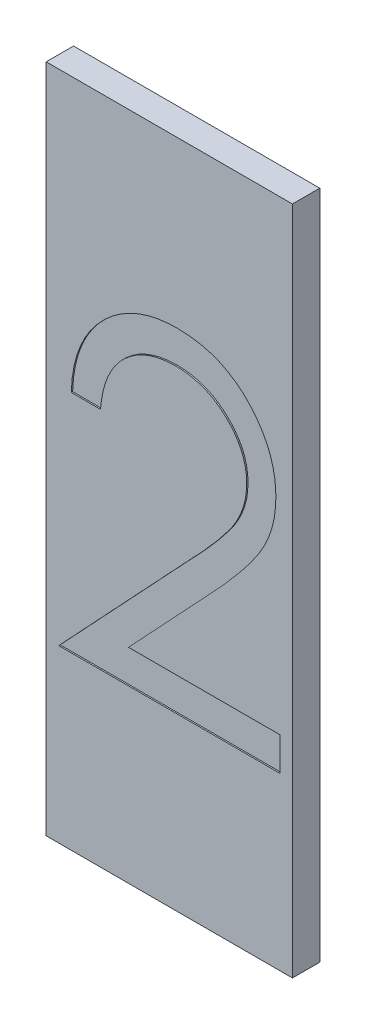
ISO-10303-21;
HEADER;
FILE_DESCRIPTION(('STEP AP214'),'2;1');
FILE_NAME('part.step','',(''),(''),'','','');
FILE_SCHEMA(('AUTOMOTIVE_DESIGN { 1 0 10303 214 1 1 1 1 }'));
ENDSEC;
DATA;
#1=APPLICATION_CONTEXT('core data for automotive mechanical design processes');
#2=APPLICATION_PROTOCOL_DEFINITION('international standard','automotive_design',2000,#1);
#3=PRODUCT_CONTEXT('',#1,'mechanical');
#4=PRODUCT('Part','Part','',(#3));
#5=PRODUCT_RELATED_PRODUCT_CATEGORY('part','',(#4));
#6=PRODUCT_DEFINITION_FORMATION('','',#4);
#7=PRODUCT_DEFINITION_CONTEXT('part definition',#1,'design');
#8=PRODUCT_DEFINITION('design','',#6,#7);
#9=PRODUCT_DEFINITION_SHAPE('','',#8);
#10=(LENGTH_UNIT() NAMED_UNIT(*) SI_UNIT(.MILLI.,.METRE.));
#11=(NAMED_UNIT(*) PLANE_ANGLE_UNIT() SI_UNIT($,.RADIAN.));
#12=(NAMED_UNIT(*) SI_UNIT($,.STERADIAN.) SOLID_ANGLE_UNIT());
#13=UNCERTAINTY_MEASURE_WITH_UNIT(LENGTH_MEASURE(1.E-05),#10,'distance_accuracy_value','');
#14=(GEOMETRIC_REPRESENTATION_CONTEXT(3) GLOBAL_UNCERTAINTY_ASSIGNED_CONTEXT((#13)) GLOBAL_UNIT_ASSIGNED_CONTEXT((#10,
#11,#12)) REPRESENTATION_CONTEXT('',''));
#15=CARTESIAN_POINT('',(0.,0.,0.));
#16=DIRECTION('',(0.,0.,1.));
#17=DIRECTION('',(1.,0.,0.));
#18=AXIS2_PLACEMENT_3D('',#15,#16,#17);
#19=CARTESIAN_POINT('',(0.,0.,2.));
#20=DIRECTION('',(0.,0.,1.));
#21=DIRECTION('',(1.,0.,0.));
#22=AXIS2_PLACEMENT_3D('',#19,#20,#21);
#23=PLANE('',#22);
#24=DIRECTION('',(0.,-1.,0.));
#25=VECTOR('',#24,1.);
#26=CARTESIAN_POINT('',(0.,0.,2.));
#27=LINE('',#26,#25);
#28=CARTESIAN_POINT('',(0.,49.,2.));
#29=VERTEX_POINT('',#28);
#30=CARTESIAN_POINT('',(0.,0.,2.));
#31=VERTEX_POINT('',#30);
#32=EDGE_CURVE('E186',#29,#31,#27,.T.);
#33=ORIENTED_EDGE('',*,*,#32,.T.);
#34=DIRECTION('',(1.,0.,0.));
#35=VECTOR('',#34,1.);
#36=CARTESIAN_POINT('',(18.,0.,2.));
#37=LINE('',#36,#35);
#38=CARTESIAN_POINT('',(18.,0.,2.));
#39=VERTEX_POINT('',#38);
#40=EDGE_CURVE('E85',#31,#39,#37,.T.);
#41=ORIENTED_EDGE('',*,*,#40,.T.);
#42=DIRECTION('',(0.,1.,0.));
#43=VECTOR('',#42,1.);
#44=CARTESIAN_POINT('',(18.,0.,2.));
#45=LINE('',#44,#43);
#46=CARTESIAN_POINT('',(18.,49.,2.));
#47=VERTEX_POINT('',#46);
#48=EDGE_CURVE('E189',#39,#47,#45,.T.);
#49=ORIENTED_EDGE('',*,*,#48,.T.);
#50=DIRECTION('',(-1.,0.,0.));
#51=VECTOR('',#50,1.);
#52=CARTESIAN_POINT('',(18.,49.,2.));
#53=LINE('',#52,#51);
#54=EDGE_CURVE('E57',#47,#29,#53,.T.);
#55=ORIENTED_EDGE('',*,*,#54,.T.);
#56=EDGE_LOOP('',(#33,#41,#49,#55));
#57=FACE_BOUND('',#56,.T.);
#58=CARTESIAN_POINT('',(14.6538461538462,29.6533954326923,2.));
#59=CARTESIAN_POINT('',(14.6495208357019,29.8158742325944,2.));
#60=CARTESIAN_POINT('',(14.6409964642234,30.1360887466597,2.));
#61=CARTESIAN_POINT('',(14.5657646294888,30.6055743571257,2.));
#62=CARTESIAN_POINT('',(14.4520735076672,31.058452822551,2.));
#63=CARTESIAN_POINT('',(14.2891602341625,31.4961171776206,2.));
#64=CARTESIAN_POINT('',(14.0741215203676,31.914167060428,2.));
#65=CARTESIAN_POINT('',(13.8123651319997,32.3131113453846,2.));
#66=CARTESIAN_POINT('',(13.5103541648174,32.6987987693352,2.));
#67=CARTESIAN_POINT('',(13.1609821359771,33.0604310293374,2.));
#68=CARTESIAN_POINT('',(12.7771823315787,33.3916370880663,2.));
#69=CARTESIAN_POINT('',(12.3717285977935,33.6850348834748,2.));
#70=CARTESIAN_POINT('',(11.9427627098823,33.9302295480167,2.));
#71=CARTESIAN_POINT('',(11.4920933072218,34.1312308413336,2.));
#72=CARTESIAN_POINT('',(11.0209768099971,34.2889062026872,2.));
#73=CARTESIAN_POINT('',(10.528502026218,34.3981618948337,2.));
#74=CARTESIAN_POINT('',(10.0160297011531,34.4667587945421,2.));
#75=CARTESIAN_POINT('',(9.6660982394007,34.4760400355615,2.));
#76=CARTESIAN_POINT('',(9.48779296875,34.4807692307692,2.));
#77=B_SPLINE_CURVE_WITH_KNOTS('',3,(#58,#59,#60,#61,#62,#63,#64,#65,#66,#67,#68,#69,#70,#71,#72,
#73,#74,#75,#76),.UNSPECIFIED.,.F.,.F.,(4,1,1,1,1,1,1,1,1,1,1,1,1,1,1,1,4),(0.,
0.0619654006870623,0.122121905638296,0.180988496849842,0.239933216451902,0.299905831106524,
0.359988847476987,0.421775741741646,0.486575826421127,0.551534804619741,0.61501754275998,
0.677258616661657,0.739729962362713,0.803050102662951,0.866495132015698,0.931973474177149,1.),.UNSPECIFIED.);
#78=CARTESIAN_POINT('',(14.6538461538462,29.6533954326923,2.));
#79=VERTEX_POINT('',#78);
#80=CARTESIAN_POINT('',(9.48779296875,34.4807692307692,2.));
#81=VERTEX_POINT('',#80);
#82=EDGE_CURVE('E171',#79,#81,#77,.T.);
#83=ORIENTED_EDGE('',*,*,#82,.T.);
#84=CARTESIAN_POINT('',(9.48779296875,34.4807692307692,2.));
#85=CARTESIAN_POINT('',(9.30157355303286,34.4759044576878,2.));
#86=CARTESIAN_POINT('',(8.93586936803907,34.4663508465992,2.));
#87=CARTESIAN_POINT('',(8.39893809038155,34.3995216505106,2.));
#88=CARTESIAN_POINT('',(7.88672592544241,34.2842294149529,2.));
#89=CARTESIAN_POINT('',(7.39794440713774,34.1265452552841,2.));
#90=CARTESIAN_POINT('',(6.93176651080472,33.9261219141893,2.));
#91=CARTESIAN_POINT('',(6.4904593540508,33.6764870084284,2.));
#92=CARTESIAN_POINT('',(6.075013625336,33.3786028853727,2.));
#93=CARTESIAN_POINT('',(5.68464835043184,33.0408698146681,2.));
#94=CARTESIAN_POINT('',(5.32498449287451,32.6648527421097,2.));
#95=CARTESIAN_POINT('',(5.00897985529355,32.2456849576721,2.));
#96=CARTESIAN_POINT('',(4.73286361620919,31.791019863808,2.));
#97=CARTESIAN_POINT('',(4.49195436699842,31.3020842608273,2.));
#98=CARTESIAN_POINT('',(4.29631297554243,30.774441579147,2.));
#99=CARTESIAN_POINT('',(4.14681707707369,30.2099648729459,2.));
#100=CARTESIAN_POINT('',(4.02852442348558,29.6111051170872,2.));
#101=CARTESIAN_POINT('',(3.98900573865615,29.1975494504737,2.));
#102=CARTESIAN_POINT('',(3.96875,28.9855769230769,2.));
#103=B_SPLINE_CURVE_WITH_KNOTS('',3,(#84,#85,#86,#87,#88,#89,#90,#91,#92,#93,#94,#95,#96,#97,
#98,#99,#100,#101,#102),.UNSPECIFIED.,.F.,.F.,(4,1,1,1,1,1,1,1,1,1,1,1,1,1,1,1,4),(0.,
0.0644386715952428,0.126546911271677,0.18688715343657,0.245877535589455,0.304040884691267,
0.362191218072661,0.420975932791644,0.480660283279666,0.540600274953758,0.600689098349453,
0.661935789757196,0.724442505913983,0.789038393881744,0.856313757050994,0.926352028205863,1.),.UNSPECIFIED.);
#104=CARTESIAN_POINT('',(3.96875,28.9855769230769,2.));
#105=VERTEX_POINT('',#104);
#106=EDGE_CURVE('E48',#81,#105,#103,.T.);
#107=ORIENTED_EDGE('',*,*,#106,.T.);
#108=DIRECTION('',(-1.,0.,0.));
#109=VECTOR('',#108,1.);
#110=CARTESIAN_POINT('',(3.96875,28.9855769230769,2.));
#111=LINE('',#110,#109);
#112=CARTESIAN_POINT('',(1.83173076923077,28.9855769230769,2.));
#113=VERTEX_POINT('',#112);
#114=EDGE_CURVE('E175',#105,#113,#111,.T.);
#115=ORIENTED_EDGE('',*,*,#114,.T.);
#116=CARTESIAN_POINT('',(1.83173076923077,28.9855769230769,2.));
#117=CARTESIAN_POINT('',(1.84565872094543,29.2690877844971,2.));
#118=CARTESIAN_POINT('',(1.87301284744388,29.8258955711585,2.));
#119=CARTESIAN_POINT('',(2.00111245831392,30.6377242914809,2.));
#120=CARTESIAN_POINT('',(2.18440664072561,31.4137042613768,2.));
#121=CARTESIAN_POINT('',(2.44356456893349,32.1476049260632,2.));
#122=CARTESIAN_POINT('',(2.76541620875994,32.8459153823981,2.));
#123=CARTESIAN_POINT('',(3.15138300219064,33.5058619177263,2.));
#124=CARTESIAN_POINT('',(3.60854116371947,34.1249269695168,2.));
#125=CARTESIAN_POINT('',(4.12701912213568,34.6973715997948,2.));
#126=CARTESIAN_POINT('',(4.69014146999204,35.2225227511261,2.));
#127=CARTESIAN_POINT('',(5.29774080817893,35.6760164566466,2.));
#128=CARTESIAN_POINT('',(5.93622215453755,36.0591777564486,2.));
#129=CARTESIAN_POINT('',(6.60364842249853,36.3794983481429,2.));
#130=CARTESIAN_POINT('',(7.30754975671553,36.6199355141516,2.));
#131=CARTESIAN_POINT('',(8.0415384859446,36.7983363121757,2.));
#132=CARTESIAN_POINT('',(8.80883939615881,36.9056718071743,2.));
#133=CARTESIAN_POINT('',(9.33162597472812,36.9172092056607,2.));
#134=CARTESIAN_POINT('',(9.59750600961539,36.9230769230769,2.));
#135=B_SPLINE_CURVE_WITH_KNOTS('',3,(#116,#117,#118,#119,#120,#121,#122,#123,#124,#125,#126,
#127,#128,#129,#130,#131,#132,#133,#134),.UNSPECIFIED.,.F.,.F.,(4,1,1,1,1,1,1,1,1,1,1,1,1,1,1,1,
4),(0.,0.0687907943906181,0.135103289431128,0.198978674310652,0.261904299780856,
0.323494969367969,0.385195377966051,0.446969238740774,0.509764776703132,0.572250568847368,
0.633405175661153,0.693251162921753,0.75258316278567,0.812579266153421,0.873275084920192,
0.935549942895029,1.),.UNSPECIFIED.);
#136=CARTESIAN_POINT('',(9.59750600961539,36.9230769230769,2.));
#137=VERTEX_POINT('',#136);
#138=EDGE_CURVE('E388',#113,#137,#135,.T.);
#139=ORIENTED_EDGE('',*,*,#138,.T.);
#140=CARTESIAN_POINT('',(9.59750600961539,36.9230769230769,2.));
#141=CARTESIAN_POINT('',(9.85861397795963,36.916964210475,2.));
#142=CARTESIAN_POINT('',(10.3716818085684,36.9049529485679,2.));
#143=CARTESIAN_POINT('',(11.1204965854711,36.8018038030177,2.));
#144=CARTESIAN_POINT('',(11.8333563924452,36.6402489742133,2.));
#145=CARTESIAN_POINT('',(12.5088678039603,36.4135851596532,2.));
#146=CARTESIAN_POINT('',(13.1416412075611,36.1088911090004,2.));
#147=CARTESIAN_POINT('',(13.7364301357034,35.7428757120584,2.));
#148=CARTESIAN_POINT('',(14.3003156519779,35.3195586450442,2.));
#149=CARTESIAN_POINT('',(14.8079082333392,34.8211710928328,2.));
#150=CARTESIAN_POINT('',(15.2740078438573,34.2891155842041,2.));
#151=CARTESIAN_POINT('',(15.676114258321,33.7210996685571,2.));
#152=CARTESIAN_POINT('',(16.0204645312377,33.1344325639603,2.));
#153=CARTESIAN_POINT('',(16.307491424715,32.5246406924861,2.));
#154=CARTESIAN_POINT('',(16.5187840842831,31.8859824456069,2.));
#155=CARTESIAN_POINT('',(16.6792001067686,31.2277559408995,2.));
#156=CARTESIAN_POINT('',(16.7698741177537,30.5431478517298,2.));
#157=CARTESIAN_POINT('',(16.783790302623,30.0797800356264,2.));
#158=CARTESIAN_POINT('',(16.7908653846154,29.8442007211538,2.));
#159=B_SPLINE_CURVE_WITH_KNOTS('',3,(#140,#141,#142,#143,#144,#145,#146,#147,#148,#149,#150,
#151,#152,#153,#154,#155,#156,#157,#158),.UNSPECIFIED.,.F.,.F.,(4,1,1,1,1,1,1,1,1,1,1,1,1,1,1,1,
4),(0.,0.0694754602496704,0.136516797617799,0.200788823609261,0.263829672855826,
0.32573502296542,0.387290692215291,0.449509218762603,0.512967819545441,0.576275215493061,
0.637580100263924,0.697902605917102,0.757172088426985,0.816598528488655,0.876653170892819,
0.93728964241024,1.),.UNSPECIFIED.);
#160=CARTESIAN_POINT('',(16.7908653846154,29.8442007211538,2.));
#161=VERTEX_POINT('',#160);
#162=EDGE_CURVE('E343',#137,#161,#159,.T.);
#163=ORIENTED_EDGE('',*,*,#162,.T.);
#164=CARTESIAN_POINT('',(16.7908653846154,29.8442007211538,2.));
#165=CARTESIAN_POINT('',(16.779345149824,29.5125413466358,2.));
#166=CARTESIAN_POINT('',(16.7565068440513,28.855042750056,2.));
#167=CARTESIAN_POINT('',(16.5611465320479,27.8888344874232,2.));
#168=CARTESIAN_POINT('',(16.2560300904878,26.9527078325656,2.));
#169=CARTESIAN_POINT('',(15.8886552162092,26.1992986880268,2.));
#170=CARTESIAN_POINT('',(15.5180480521467,25.5921922394299,2.));
#171=CARTESIAN_POINT('',(15.1840776879828,25.0923426577437,2.));
#172=CARTESIAN_POINT('',(14.7931117415666,24.5541429531659,2.));
#173=CARTESIAN_POINT('',(14.3394598179276,23.9793953542467,2.));
#174=CARTESIAN_POINT('',(13.832506169902,23.363597946344,2.));
#175=CARTESIAN_POINT('',(13.2676589513506,22.7071227312226,2.));
#176=CARTESIAN_POINT('',(12.6408902611693,22.0167522972684,2.));
#177=CARTESIAN_POINT('',(12.2009815328228,21.5452266878262,2.));
#178=CARTESIAN_POINT('',(11.9730318509615,21.3008939302885,2.));
#179=B_SPLINE_CURVE_WITH_KNOTS('',3,(#164,#165,#166,#167,#168,#169,#170,#171,#172,#173,#174,
#175,#176,#177,#178),.UNSPECIFIED.,.F.,.F.,(4,1,1,1,1,1,1,1,1,1,1,1,4),(0.,0.0987021963061522,
0.195672308810664,0.292422426507954,0.391342543799825,0.444462440671892,0.504228775449316,
0.570352337994678,0.642545753097748,0.722287505344018,0.807921122682712,0.900469537985015,1.),.UNSPECIFIED.);
#180=CARTESIAN_POINT('',(11.9730318509615,21.3008939302885,2.));
#181=VERTEX_POINT('',#180);
#182=EDGE_CURVE('E340',#161,#181,#179,.T.);
#183=ORIENTED_EDGE('',*,*,#182,.T.);
#184=DIRECTION('',(-0.683740795861405,-0.729724964678345,0.));
#185=VECTOR('',#184,1.);
#186=CARTESIAN_POINT('',(11.9730318509615,21.3008939302885,2.));
#187=LINE('',#186,#185);
#188=CARTESIAN_POINT('',(6.01513671875,14.9423076923077,2.));
#189=VERTEX_POINT('',#188);
#190=EDGE_CURVE('E333',#181,#189,#187,.T.);
#191=ORIENTED_EDGE('',*,*,#190,.T.);
#192=DIRECTION('',(1.,0.,0.));
#193=VECTOR('',#192,1.);
#194=CARTESIAN_POINT('',(6.01513671875,14.9423076923077,2.));
#195=LINE('',#194,#193);
#196=CARTESIAN_POINT('',(17.0961538461538,14.9423076923077,2.));
#197=VERTEX_POINT('',#196);
#198=EDGE_CURVE('E324',#189,#197,#195,.T.);
#199=ORIENTED_EDGE('',*,*,#198,.T.);
#200=DIRECTION('',(0.,-1.,0.));
#201=VECTOR('',#200,1.);
#202=CARTESIAN_POINT('',(17.0961538461538,14.9423076923077,2.));
#203=LINE('',#202,#201);
#204=CARTESIAN_POINT('',(17.0961538461538,12.5,2.));
#205=VERTEX_POINT('',#204);
#206=EDGE_CURVE('E332',#197,#205,#203,.T.);
#207=ORIENTED_EDGE('',*,*,#206,.T.);
#208=DIRECTION('',(-1.,0.,0.));
#209=VECTOR('',#208,1.);
#210=CARTESIAN_POINT('',(17.0961538461538,12.5,2.));
#211=LINE('',#210,#209);
#212=CARTESIAN_POINT('',(0.915865384615385,12.5,2.));
#213=VERTEX_POINT('',#212);
#214=EDGE_CURVE('E350',#205,#213,#211,.T.);
#215=ORIENTED_EDGE('',*,*,#214,.T.);
#216=DIRECTION('',(0.683776631973393,0.729691385153424,0.));
#217=VECTOR('',#216,1.);
#218=CARTESIAN_POINT('',(0.915865384615385,12.5,2.));
#219=LINE('',#218,#217);
#220=CARTESIAN_POINT('',(10.1508413461538,22.3550931490385,2.));
#221=VERTEX_POINT('',#220);
#222=EDGE_CURVE('E353',#213,#221,#219,.T.);
#223=ORIENTED_EDGE('',*,*,#222,.T.);
#224=CARTESIAN_POINT('',(10.1508413461538,22.3550931490385,2.));
#225=CARTESIAN_POINT('',(10.3756850046144,22.5898048418067,2.));
#226=CARTESIAN_POINT('',(10.807563656977,23.0406379685245,2.));
#227=CARTESIAN_POINT('',(11.4184058313396,23.6988356080078,2.));
#228=CARTESIAN_POINT('',(11.9670389482507,24.3094530191963,2.));
#229=CARTESIAN_POINT('',(12.4570144240733,24.8713365005775,2.));
#230=CARTESIAN_POINT('',(12.8777030945087,25.3927048457577,2.));
#231=CARTESIAN_POINT('',(13.2510302440105,25.8566723826673,2.));
#232=CARTESIAN_POINT('',(13.5501532826564,26.2836267677979,2.));
#233=CARTESIAN_POINT('',(13.87478838546,26.7785227303099,2.));
#234=CARTESIAN_POINT('',(14.1892085089015,27.3827636739405,2.));
#235=CARTESIAN_POINT('',(14.4593943598192,28.1211803812344,2.));
#236=CARTESIAN_POINT('',(14.6241418108714,28.8813247253336,2.));
#237=CARTESIAN_POINT('',(14.6439050667235,29.3950082273873,2.));
#238=CARTESIAN_POINT('',(14.6538461538462,29.6533954326923,2.));
#239=B_SPLINE_CURVE_WITH_KNOTS('',3,(#224,#225,#226,#227,#228,#229,#230,#231,#232,#233,#234,
#235,#236,#237,#238),.UNSPECIFIED.,.F.,.F.,(4,1,1,1,1,1,1,1,1,1,1,1,4),(0.,0.110802643801319,
0.21282920234777,0.306101309823111,0.39064732111601,0.466924469360852,0.534481039284031,
0.593586940965673,0.644557004508718,0.736200452629373,0.825024025618865,0.911985584829759,1.),.UNSPECIFIED.);
#240=EDGE_CURVE('E356',#221,#79,#239,.T.);
#241=ORIENTED_EDGE('',*,*,#240,.T.);
#242=EDGE_LOOP('',(#83,#107,#115,#139,#163,#183,#191,#199,#207,#215,#223,#241));
#243=FACE_BOUND('',#242,.T.);
#244=ADVANCED_FACE('F33',(#57,#243),#23,.T.);
#245=CARTESIAN_POINT('',(0.,0.,2.));
#246=DIRECTION('',(1.,0.,0.));
#247=DIRECTION('',(0.,0.,-1.));
#248=AXIS2_PLACEMENT_3D('',#245,#246,#247);
#249=PLANE('',#248);
#250=DIRECTION('',(0.,-1.,0.));
#251=VECTOR('',#250,1.);
#252=CARTESIAN_POINT('',(0.,0.,0.));
#253=LINE('',#252,#251);
#254=CARTESIAN_POINT('',(0.,49.,0.));
#255=VERTEX_POINT('',#254);
#256=CARTESIAN_POINT('',(0.,0.,0.));
#257=VERTEX_POINT('',#256);
#258=EDGE_CURVE('E176',#255,#257,#253,.T.);
#259=ORIENTED_EDGE('',*,*,#258,.T.);
#260=DIRECTION('',(0.,0.,-1.));
#261=VECTOR('',#260,1.);
#262=CARTESIAN_POINT('',(0.,0.,2.));
#263=LINE('',#262,#261);
#264=EDGE_CURVE('E11',#31,#257,#263,.T.);
#265=ORIENTED_EDGE('',*,*,#264,.F.);
#266=ORIENTED_EDGE('',*,*,#32,.F.);
#267=DIRECTION('',(0.,0.,-1.));
#268=VECTOR('',#267,1.);
#269=CARTESIAN_POINT('',(0.,49.,2.));
#270=LINE('',#269,#268);
#271=EDGE_CURVE('E191',#29,#255,#270,.T.);
#272=ORIENTED_EDGE('',*,*,#271,.T.);
#273=EDGE_LOOP('',(#259,#265,#266,#272));
#274=FACE_BOUND('',#273,.T.);
#275=ADVANCED_FACE('F35',(#274),#249,.F.);
#276=CARTESIAN_POINT('',(18.,0.,2.));
#277=DIRECTION('',(0.,1.,0.));
#278=DIRECTION('',(0.,0.,1.));
#279=AXIS2_PLACEMENT_3D('',#276,#277,#278);
#280=PLANE('',#279);
#281=DIRECTION('',(1.,0.,0.));
#282=VECTOR('',#281,1.);
#283=CARTESIAN_POINT('',(18.,0.,0.));
#284=LINE('',#283,#282);
#285=CARTESIAN_POINT('',(18.,0.,0.));
#286=VERTEX_POINT('',#285);
#287=EDGE_CURVE('E180',#257,#286,#284,.T.);
#288=ORIENTED_EDGE('',*,*,#287,.T.);
#289=DIRECTION('',(0.,0.,-1.));
#290=VECTOR('',#289,1.);
#291=CARTESIAN_POINT('',(18.,0.,2.));
#292=LINE('',#291,#290);
#293=EDGE_CURVE('E41',#39,#286,#292,.T.);
#294=ORIENTED_EDGE('',*,*,#293,.F.);
#295=ORIENTED_EDGE('',*,*,#40,.F.);
#296=ORIENTED_EDGE('',*,*,#264,.T.);
#297=EDGE_LOOP('',(#288,#294,#295,#296));
#298=FACE_BOUND('',#297,.T.);
#299=ADVANCED_FACE('F219',(#298),#280,.F.);
#300=CARTESIAN_POINT('',(18.,0.,2.));
#301=DIRECTION('',(-1.,0.,0.));
#302=DIRECTION('',(0.,0.,1.));
#303=AXIS2_PLACEMENT_3D('',#300,#301,#302);
#304=PLANE('',#303);
#305=DIRECTION('',(0.,1.,0.));
#306=VECTOR('',#305,1.);
#307=CARTESIAN_POINT('',(18.,0.,0.));
#308=LINE('',#307,#306);
#309=CARTESIAN_POINT('',(18.,49.,0.));
#310=VERTEX_POINT('',#309);
#311=EDGE_CURVE('E194',#286,#310,#308,.T.);
#312=ORIENTED_EDGE('',*,*,#311,.T.);
#313=DIRECTION('',(0.,0.,-1.));
#314=VECTOR('',#313,1.);
#315=CARTESIAN_POINT('',(18.,49.,2.));
#316=LINE('',#315,#314);
#317=EDGE_CURVE('E198',#47,#310,#316,.T.);
#318=ORIENTED_EDGE('',*,*,#317,.F.);
#319=ORIENTED_EDGE('',*,*,#48,.F.);
#320=ORIENTED_EDGE('',*,*,#293,.T.);
#321=EDGE_LOOP('',(#312,#318,#319,#320));
#322=FACE_BOUND('',#321,.T.);
#323=ADVANCED_FACE('F203',(#322),#304,.F.);
#324=CARTESIAN_POINT('',(18.,49.,2.));
#325=DIRECTION('',(0.,-1.,0.));
#326=DIRECTION('',(0.,0.,-1.));
#327=AXIS2_PLACEMENT_3D('',#324,#325,#326);
#328=PLANE('',#327);
#329=DIRECTION('',(-1.,0.,0.));
#330=VECTOR('',#329,1.);
#331=CARTESIAN_POINT('',(18.,49.,0.));
#332=LINE('',#331,#330);
#333=EDGE_CURVE('E78',#310,#255,#332,.T.);
#334=ORIENTED_EDGE('',*,*,#333,.T.);
#335=ORIENTED_EDGE('',*,*,#271,.F.);
#336=ORIENTED_EDGE('',*,*,#54,.F.);
#337=ORIENTED_EDGE('',*,*,#317,.T.);
#338=EDGE_LOOP('',(#334,#335,#336,#337));
#339=FACE_BOUND('',#338,.T.);
#340=ADVANCED_FACE('F211',(#339),#328,.F.);
#341=CARTESIAN_POINT('',(0.,0.,0.));
#342=DIRECTION('',(0.,0.,1.));
#343=DIRECTION('',(1.,0.,0.));
#344=AXIS2_PLACEMENT_3D('',#341,#342,#343);
#345=PLANE('',#344);
#346=ORIENTED_EDGE('',*,*,#258,.F.);
#347=ORIENTED_EDGE('',*,*,#333,.F.);
#348=ORIENTED_EDGE('',*,*,#311,.F.);
#349=ORIENTED_EDGE('',*,*,#287,.F.);
#350=EDGE_LOOP('',(#346,#347,#348,#349));
#351=FACE_BOUND('',#350,.T.);
#352=ADVANCED_FACE('F207',(#351),#345,.F.);
#353=CARTESIAN_POINT('',(9.48779296875,34.4807692307692,1.9));
#354=CARTESIAN_POINT('',(9.30157355303286,34.4759044576878,1.9));
#355=CARTESIAN_POINT('',(8.93586936803907,34.4663508465992,1.9));
#356=CARTESIAN_POINT('',(8.39893809038155,34.3995216505106,1.9));
#357=CARTESIAN_POINT('',(7.88672592544241,34.2842294149529,1.9));
#358=CARTESIAN_POINT('',(7.39794440713774,34.1265452552841,1.9));
#359=CARTESIAN_POINT('',(6.93176651080472,33.9261219141893,1.9));
#360=CARTESIAN_POINT('',(6.4904593540508,33.6764870084284,1.9));
#361=CARTESIAN_POINT('',(6.075013625336,33.3786028853727,1.9));
#362=CARTESIAN_POINT('',(5.68464835043184,33.0408698146681,1.9));
#363=CARTESIAN_POINT('',(5.32498449287451,32.6648527421097,1.9));
#364=CARTESIAN_POINT('',(5.00897985529355,32.2456849576721,1.9));
#365=CARTESIAN_POINT('',(4.73286361620919,31.791019863808,1.9));
#366=CARTESIAN_POINT('',(4.49195436699842,31.3020842608273,1.9));
#367=CARTESIAN_POINT('',(4.29631297554243,30.774441579147,1.9));
#368=CARTESIAN_POINT('',(4.14681707707369,30.2099648729459,1.9));
#369=CARTESIAN_POINT('',(4.02852442348558,29.6111051170872,1.9));
#370=CARTESIAN_POINT('',(3.98900573865615,29.1975494504737,1.9));
#371=CARTESIAN_POINT('',(3.96875,28.9855769230769,1.9));
#372=B_SPLINE_CURVE_WITH_KNOTS('',3,(#353,#354,#355,#356,#357,#358,#359,#360,#361,#362,#363,
#364,#365,#366,#367,#368,#369,#370,#371),.UNSPECIFIED.,.F.,.F.,(4,1,1,1,1,1,1,1,1,1,1,1,1,1,1,1,
4),(0.,0.0644386715952428,0.126546911271677,0.18688715343657,0.245877535589455,
0.304040884691267,0.362191218072661,0.420975932791644,0.480660283279666,0.540600274953758,
0.600689098349453,0.661935789757196,0.724442505913983,0.789038393881744,0.856313757050994,
0.926352028205863,1.),.UNSPECIFIED.);
#373=DIRECTION('',(0.,0.,1.));
#374=VECTOR('',#373,1.);
#375=SURFACE_OF_LINEAR_EXTRUSION('',#372,#374);
#376=ORIENTED_EDGE('',*,*,#106,.F.);
#377=DIRECTION('',(0.,0.,1.));
#378=VECTOR('',#377,1.);
#379=CARTESIAN_POINT('',(9.48779296875,34.4807692307692,1.9));
#380=LINE('',#379,#378);
#381=CARTESIAN_POINT('',(9.48779296875,34.4807692307692,1.9));
#382=VERTEX_POINT('',#381);
#383=EDGE_CURVE('E170',#382,#81,#380,.T.);
#384=ORIENTED_EDGE('',*,*,#383,.F.);
#385=CARTESIAN_POINT('',(3.96875,28.9855769230769,1.9));
#386=VERTEX_POINT('',#385);
#387=EDGE_CURVE('E161',#382,#386,#372,.T.);
#388=ORIENTED_EDGE('',*,*,#387,.T.);
#389=DIRECTION('',(0.,0.,1.));
#390=VECTOR('',#389,1.);
#391=CARTESIAN_POINT('',(3.96875,28.9855769230769,1.9));
#392=LINE('',#391,#390);
#393=EDGE_CURVE('E169',#386,#105,#392,.T.);
#394=ORIENTED_EDGE('',*,*,#393,.T.);
#395=EDGE_LOOP('',(#376,#384,#388,#394));
#396=FACE_BOUND('',#395,.T.);
#397=ADVANCED_FACE('F168',(#396),#375,.T.);
#398=CARTESIAN_POINT('',(3.96875,28.9855769230769,1.9));
#399=DIRECTION('',(0.,1.,0.));
#400=DIRECTION('',(0.,0.,1.));
#401=AXIS2_PLACEMENT_3D('',#398,#399,#400);
#402=PLANE('',#401);
#403=ORIENTED_EDGE('',*,*,#114,.F.);
#404=ORIENTED_EDGE('',*,*,#393,.F.);
#405=DIRECTION('',(-1.,0.,0.));
#406=VECTOR('',#405,1.);
#407=CARTESIAN_POINT('',(3.96875,28.9855769230769,1.9));
#408=LINE('',#407,#406);
#409=CARTESIAN_POINT('',(1.83173076923077,28.9855769230769,1.9));
#410=VERTEX_POINT('',#409);
#411=EDGE_CURVE('E157',#386,#410,#408,.T.);
#412=ORIENTED_EDGE('',*,*,#411,.T.);
#413=DIRECTION('',(0.,0.,1.));
#414=VECTOR('',#413,1.);
#415=CARTESIAN_POINT('',(1.83173076923077,28.9855769230769,1.9));
#416=LINE('',#415,#414);
#417=EDGE_CURVE('E177',#410,#113,#416,.T.);
#418=ORIENTED_EDGE('',*,*,#417,.T.);
#419=EDGE_LOOP('',(#403,#404,#412,#418));
#420=FACE_BOUND('',#419,.T.);
#421=ADVANCED_FACE('F173',(#420),#402,.T.);
#422=CARTESIAN_POINT('',(1.83173076923077,28.9855769230769,1.9));
#423=CARTESIAN_POINT('',(1.84565872094543,29.2690877844971,1.9));
#424=CARTESIAN_POINT('',(1.87301284744388,29.8258955711585,1.9));
#425=CARTESIAN_POINT('',(2.00111245831392,30.6377242914809,1.9));
#426=CARTESIAN_POINT('',(2.18440664072561,31.4137042613768,1.9));
#427=CARTESIAN_POINT('',(2.44356456893349,32.1476049260632,1.9));
#428=CARTESIAN_POINT('',(2.76541620875994,32.8459153823981,1.9));
#429=CARTESIAN_POINT('',(3.15138300219064,33.5058619177263,1.9));
#430=CARTESIAN_POINT('',(3.60854116371947,34.1249269695168,1.9));
#431=CARTESIAN_POINT('',(4.12701912213568,34.6973715997948,1.9));
#432=CARTESIAN_POINT('',(4.69014146999204,35.2225227511261,1.9));
#433=CARTESIAN_POINT('',(5.29774080817893,35.6760164566466,1.9));
#434=CARTESIAN_POINT('',(5.93622215453755,36.0591777564486,1.9));
#435=CARTESIAN_POINT('',(6.60364842249853,36.3794983481429,1.9));
#436=CARTESIAN_POINT('',(7.30754975671553,36.6199355141516,1.9));
#437=CARTESIAN_POINT('',(8.0415384859446,36.7983363121757,1.9));
#438=CARTESIAN_POINT('',(8.80883939615881,36.9056718071743,1.9));
#439=CARTESIAN_POINT('',(9.33162597472812,36.9172092056607,1.9));
#440=CARTESIAN_POINT('',(9.59750600961539,36.9230769230769,1.9));
#441=B_SPLINE_CURVE_WITH_KNOTS('',3,(#422,#423,#424,#425,#426,#427,#428,#429,#430,#431,#432,
#433,#434,#435,#436,#437,#438,#439,#440),.UNSPECIFIED.,.F.,.F.,(4,1,1,1,1,1,1,1,1,1,1,1,1,1,1,1,
4),(0.,0.0687907943906181,0.135103289431128,0.198978674310652,0.261904299780856,
0.323494969367969,0.385195377966051,0.446969238740774,0.509764776703132,0.572250568847368,
0.633405175661153,0.693251162921753,0.75258316278567,0.812579266153421,0.873275084920192,
0.935549942895029,1.),.UNSPECIFIED.);
#442=DIRECTION('',(0.,0.,1.));
#443=VECTOR('',#442,1.);
#444=SURFACE_OF_LINEAR_EXTRUSION('',#441,#443);
#445=ORIENTED_EDGE('',*,*,#138,.F.);
#446=ORIENTED_EDGE('',*,*,#417,.F.);
#447=CARTESIAN_POINT('',(9.59750600961539,36.9230769230769,1.9));
#448=VERTEX_POINT('',#447);
#449=EDGE_CURVE('E163',#410,#448,#441,.T.);
#450=ORIENTED_EDGE('',*,*,#449,.T.);
#451=DIRECTION('',(0.,0.,1.));
#452=VECTOR('',#451,1.);
#453=CARTESIAN_POINT('',(9.59750600961539,36.9230769230769,1.9));
#454=LINE('',#453,#452);
#455=EDGE_CURVE('E182',#448,#137,#454,.T.);
#456=ORIENTED_EDGE('',*,*,#455,.T.);
#457=EDGE_LOOP('',(#445,#446,#450,#456));
#458=FACE_BOUND('',#457,.T.);
#459=ADVANCED_FACE('F250',(#458),#444,.T.);
#460=CARTESIAN_POINT('',(9.59750600961539,36.9230769230769,1.9));
#461=CARTESIAN_POINT('',(9.85861397795963,36.916964210475,1.9));
#462=CARTESIAN_POINT('',(10.3716818085684,36.9049529485679,1.9));
#463=CARTESIAN_POINT('',(11.1204965854711,36.8018038030177,1.9));
#464=CARTESIAN_POINT('',(11.8333563924452,36.6402489742133,1.9));
#465=CARTESIAN_POINT('',(12.5088678039603,36.4135851596532,1.9));
#466=CARTESIAN_POINT('',(13.1416412075611,36.1088911090004,1.9));
#467=CARTESIAN_POINT('',(13.7364301357034,35.7428757120584,1.9));
#468=CARTESIAN_POINT('',(14.3003156519779,35.3195586450442,1.9));
#469=CARTESIAN_POINT('',(14.8079082333392,34.8211710928328,1.9));
#470=CARTESIAN_POINT('',(15.2740078438573,34.2891155842041,1.9));
#471=CARTESIAN_POINT('',(15.676114258321,33.7210996685571,1.9));
#472=CARTESIAN_POINT('',(16.0204645312377,33.1344325639603,1.9));
#473=CARTESIAN_POINT('',(16.307491424715,32.5246406924861,1.9));
#474=CARTESIAN_POINT('',(16.5187840842831,31.8859824456069,1.9));
#475=CARTESIAN_POINT('',(16.6792001067686,31.2277559408995,1.9));
#476=CARTESIAN_POINT('',(16.7698741177537,30.5431478517298,1.9));
#477=CARTESIAN_POINT('',(16.783790302623,30.0797800356264,1.9));
#478=CARTESIAN_POINT('',(16.7908653846154,29.8442007211538,1.9));
#479=B_SPLINE_CURVE_WITH_KNOTS('',3,(#460,#461,#462,#463,#464,#465,#466,#467,#468,#469,#470,
#471,#472,#473,#474,#475,#476,#477,#478),.UNSPECIFIED.,.F.,.F.,(4,1,1,1,1,1,1,1,1,1,1,1,1,1,1,1,
4),(0.,0.0694754602496704,0.136516797617799,0.200788823609261,0.263829672855826,
0.32573502296542,0.387290692215291,0.449509218762603,0.512967819545441,0.576275215493061,
0.637580100263924,0.697902605917102,0.757172088426985,0.816598528488655,0.876653170892819,
0.93728964241024,1.),.UNSPECIFIED.);
#480=DIRECTION('',(0.,0.,1.));
#481=VECTOR('',#480,1.);
#482=SURFACE_OF_LINEAR_EXTRUSION('',#479,#481);
#483=ORIENTED_EDGE('',*,*,#162,.F.);
#484=ORIENTED_EDGE('',*,*,#455,.F.);
#485=CARTESIAN_POINT('',(16.7908653846154,29.8442007211538,1.9));
#486=VERTEX_POINT('',#485);
#487=EDGE_CURVE('E242',#448,#486,#479,.T.);
#488=ORIENTED_EDGE('',*,*,#487,.T.);
#489=DIRECTION('',(0.,0.,1.));
#490=VECTOR('',#489,1.);
#491=CARTESIAN_POINT('',(16.7908653846154,29.8442007211538,1.9));
#492=LINE('',#491,#490);
#493=EDGE_CURVE('E383',#486,#161,#492,.T.);
#494=ORIENTED_EDGE('',*,*,#493,.T.);
#495=EDGE_LOOP('',(#483,#484,#488,#494));
#496=FACE_BOUND('',#495,.T.);
#497=ADVANCED_FACE('F253',(#496),#482,.T.);
#498=CARTESIAN_POINT('',(16.7908653846154,29.8442007211538,1.9));
#499=CARTESIAN_POINT('',(16.779345149824,29.5125413466358,1.9));
#500=CARTESIAN_POINT('',(16.7565068440513,28.855042750056,1.9));
#501=CARTESIAN_POINT('',(16.5611465320479,27.8888344874232,1.9));
#502=CARTESIAN_POINT('',(16.2560300904878,26.9527078325656,1.9));
#503=CARTESIAN_POINT('',(15.8886552162092,26.1992986880268,1.9));
#504=CARTESIAN_POINT('',(15.5180480521467,25.5921922394299,1.9));
#505=CARTESIAN_POINT('',(15.1840776879828,25.0923426577437,1.9));
#506=CARTESIAN_POINT('',(14.7931117415666,24.5541429531659,1.9));
#507=CARTESIAN_POINT('',(14.3394598179276,23.9793953542467,1.9));
#508=CARTESIAN_POINT('',(13.832506169902,23.363597946344,1.9));
#509=CARTESIAN_POINT('',(13.2676589513506,22.7071227312226,1.9));
#510=CARTESIAN_POINT('',(12.6408902611693,22.0167522972684,1.9));
#511=CARTESIAN_POINT('',(12.2009815328228,21.5452266878262,1.9));
#512=CARTESIAN_POINT('',(11.9730318509615,21.3008939302885,1.9));
#513=B_SPLINE_CURVE_WITH_KNOTS('',3,(#498,#499,#500,#501,#502,#503,#504,#505,#506,#507,#508,
#509,#510,#511,#512),.UNSPECIFIED.,.F.,.F.,(4,1,1,1,1,1,1,1,1,1,1,1,4),(0.,0.0987021963061522,
0.195672308810664,0.292422426507954,0.391342543799825,0.444462440671892,0.504228775449316,
0.570352337994678,0.642545753097748,0.722287505344018,0.807921122682712,0.900469537985015,1.),.UNSPECIFIED.);
#514=DIRECTION('',(0.,0.,1.));
#515=VECTOR('',#514,1.);
#516=SURFACE_OF_LINEAR_EXTRUSION('',#513,#515);
#517=ORIENTED_EDGE('',*,*,#182,.F.);
#518=ORIENTED_EDGE('',*,*,#493,.F.);
#519=CARTESIAN_POINT('',(11.9730318509615,21.3008939302885,1.9));
#520=VERTEX_POINT('',#519);
#521=EDGE_CURVE('E264',#486,#520,#513,.T.);
#522=ORIENTED_EDGE('',*,*,#521,.T.);
#523=DIRECTION('',(0.,0.,1.));
#524=VECTOR('',#523,1.);
#525=CARTESIAN_POINT('',(11.9730318509615,21.3008939302885,1.9));
#526=LINE('',#525,#524);
#527=EDGE_CURVE('E381',#520,#181,#526,.T.);
#528=ORIENTED_EDGE('',*,*,#527,.T.);
#529=EDGE_LOOP('',(#517,#518,#522,#528));
#530=FACE_BOUND('',#529,.T.);
#531=ADVANCED_FACE('F257',(#530),#516,.T.);
#532=CARTESIAN_POINT('',(11.9730318509615,21.3008939302885,1.9));
#533=DIRECTION('',(-0.729724964678345,0.683740795861405,0.));
#534=DIRECTION('',(-0.683740795861405,-0.729724964678345,0.));
#535=AXIS2_PLACEMENT_3D('',#532,#533,#534);
#536=PLANE('',#535);
#537=ORIENTED_EDGE('',*,*,#190,.F.);
#538=ORIENTED_EDGE('',*,*,#527,.F.);
#539=DIRECTION('',(-0.683740795861405,-0.729724964678345,0.));
#540=VECTOR('',#539,1.);
#541=CARTESIAN_POINT('',(11.9730318509615,21.3008939302885,1.9));
#542=LINE('',#541,#540);
#543=CARTESIAN_POINT('',(6.01513671875,14.9423076923077,1.9));
#544=VERTEX_POINT('',#543);
#545=EDGE_CURVE('E269',#520,#544,#542,.T.);
#546=ORIENTED_EDGE('',*,*,#545,.T.);
#547=DIRECTION('',(0.,0.,1.));
#548=VECTOR('',#547,1.);
#549=CARTESIAN_POINT('',(6.01513671875,14.9423076923077,1.9));
#550=LINE('',#549,#548);
#551=EDGE_CURVE('E326',#544,#189,#550,.T.);
#552=ORIENTED_EDGE('',*,*,#551,.T.);
#553=EDGE_LOOP('',(#537,#538,#546,#552));
#554=FACE_BOUND('',#553,.T.);
#555=ADVANCED_FACE('F261',(#554),#536,.T.);
#556=CARTESIAN_POINT('',(6.01513671875,14.9423076923077,1.9));
#557=DIRECTION('',(0.,-1.,0.));
#558=DIRECTION('',(0.,0.,-1.));
#559=AXIS2_PLACEMENT_3D('',#556,#557,#558);
#560=PLANE('',#559);
#561=ORIENTED_EDGE('',*,*,#198,.F.);
#562=ORIENTED_EDGE('',*,*,#551,.F.);
#563=DIRECTION('',(1.,0.,0.));
#564=VECTOR('',#563,1.);
#565=CARTESIAN_POINT('',(6.01513671875,14.9423076923077,1.9));
#566=LINE('',#565,#564);
#567=CARTESIAN_POINT('',(17.0961538461538,14.9423076923077,1.9));
#568=VERTEX_POINT('',#567);
#569=EDGE_CURVE('E274',#544,#568,#566,.T.);
#570=ORIENTED_EDGE('',*,*,#569,.T.);
#571=DIRECTION('',(0.,0.,1.));
#572=VECTOR('',#571,1.);
#573=CARTESIAN_POINT('',(17.0961538461538,14.9423076923077,1.9));
#574=LINE('',#573,#572);
#575=EDGE_CURVE('E329',#568,#197,#574,.T.);
#576=ORIENTED_EDGE('',*,*,#575,.T.);
#577=EDGE_LOOP('',(#561,#562,#570,#576));
#578=FACE_BOUND('',#577,.T.);
#579=ADVANCED_FACE('F313',(#578),#560,.T.);
#580=CARTESIAN_POINT('',(17.0961538461538,14.9423076923077,1.9));
#581=DIRECTION('',(-1.,0.,0.));
#582=DIRECTION('',(0.,0.,1.));
#583=AXIS2_PLACEMENT_3D('',#580,#581,#582);
#584=PLANE('',#583);
#585=ORIENTED_EDGE('',*,*,#206,.F.);
#586=ORIENTED_EDGE('',*,*,#575,.F.);
#587=DIRECTION('',(0.,-1.,0.));
#588=VECTOR('',#587,1.);
#589=CARTESIAN_POINT('',(17.0961538461538,14.9423076923077,1.9));
#590=LINE('',#589,#588);
#591=CARTESIAN_POINT('',(17.0961538461538,12.5,1.9));
#592=VERTEX_POINT('',#591);
#593=EDGE_CURVE('E276',#568,#592,#590,.T.);
#594=ORIENTED_EDGE('',*,*,#593,.T.);
#595=DIRECTION('',(0.,0.,1.));
#596=VECTOR('',#595,1.);
#597=CARTESIAN_POINT('',(17.0961538461538,12.5,1.9));
#598=LINE('',#597,#596);
#599=EDGE_CURVE('E377',#592,#205,#598,.T.);
#600=ORIENTED_EDGE('',*,*,#599,.T.);
#601=EDGE_LOOP('',(#585,#586,#594,#600));
#602=FACE_BOUND('',#601,.T.);
#603=ADVANCED_FACE('F310',(#602),#584,.T.);
#604=CARTESIAN_POINT('',(17.0961538461538,12.5,1.9));
#605=DIRECTION('',(0.,1.,0.));
#606=DIRECTION('',(0.,0.,1.));
#607=AXIS2_PLACEMENT_3D('',#604,#605,#606);
#608=PLANE('',#607);
#609=ORIENTED_EDGE('',*,*,#214,.F.);
#610=ORIENTED_EDGE('',*,*,#599,.F.);
#611=DIRECTION('',(-1.,0.,0.));
#612=VECTOR('',#611,1.);
#613=CARTESIAN_POINT('',(17.0961538461538,12.5,1.9));
#614=LINE('',#613,#612);
#615=CARTESIAN_POINT('',(0.915865384615385,12.5,1.9));
#616=VERTEX_POINT('',#615);
#617=EDGE_CURVE('E278',#592,#616,#614,.T.);
#618=ORIENTED_EDGE('',*,*,#617,.T.);
#619=DIRECTION('',(0.,0.,1.));
#620=VECTOR('',#619,1.);
#621=CARTESIAN_POINT('',(0.915865384615385,12.5,1.9));
#622=LINE('',#621,#620);
#623=EDGE_CURVE('E375',#616,#213,#622,.T.);
#624=ORIENTED_EDGE('',*,*,#623,.T.);
#625=EDGE_LOOP('',(#609,#610,#618,#624));
#626=FACE_BOUND('',#625,.T.);
#627=ADVANCED_FACE('F306',(#626),#608,.T.);
#628=CARTESIAN_POINT('',(0.915865384615385,12.5,1.9));
#629=DIRECTION('',(0.729691385153424,-0.683776631973393,0.));
#630=DIRECTION('',(0.683776631973393,0.729691385153424,0.));
#631=AXIS2_PLACEMENT_3D('',#628,#629,#630);
#632=PLANE('',#631);
#633=ORIENTED_EDGE('',*,*,#222,.F.);
#634=ORIENTED_EDGE('',*,*,#623,.F.);
#635=DIRECTION('',(0.683776631973393,0.729691385153424,0.));
#636=VECTOR('',#635,1.);
#637=CARTESIAN_POINT('',(0.915865384615385,12.5,1.9));
#638=LINE('',#637,#636);
#639=CARTESIAN_POINT('',(10.1508413461538,22.3550931490385,1.9));
#640=VERTEX_POINT('',#639);
#641=EDGE_CURVE('E280',#616,#640,#638,.T.);
#642=ORIENTED_EDGE('',*,*,#641,.T.);
#643=DIRECTION('',(0.,0.,1.));
#644=VECTOR('',#643,1.);
#645=CARTESIAN_POINT('',(10.1508413461538,22.3550931490385,1.9));
#646=LINE('',#645,#644);
#647=EDGE_CURVE('E373',#640,#221,#646,.T.);
#648=ORIENTED_EDGE('',*,*,#647,.T.);
#649=EDGE_LOOP('',(#633,#634,#642,#648));
#650=FACE_BOUND('',#649,.T.);
#651=ADVANCED_FACE('F301',(#650),#632,.T.);
#652=CARTESIAN_POINT('',(10.1508413461538,22.3550931490385,1.9));
#653=CARTESIAN_POINT('',(10.3756850046144,22.5898048418067,1.9));
#654=CARTESIAN_POINT('',(10.807563656977,23.0406379685245,1.9));
#655=CARTESIAN_POINT('',(11.4184058313396,23.6988356080078,1.9));
#656=CARTESIAN_POINT('',(11.9670389482507,24.3094530191963,1.9));
#657=CARTESIAN_POINT('',(12.4570144240733,24.8713365005775,1.9));
#658=CARTESIAN_POINT('',(12.8777030945087,25.3927048457577,1.9));
#659=CARTESIAN_POINT('',(13.2510302440105,25.8566723826673,1.9));
#660=CARTESIAN_POINT('',(13.5501532826564,26.2836267677979,1.9));
#661=CARTESIAN_POINT('',(13.87478838546,26.7785227303099,1.9));
#662=CARTESIAN_POINT('',(14.1892085089015,27.3827636739405,1.9));
#663=CARTESIAN_POINT('',(14.4593943598192,28.1211803812344,1.9));
#664=CARTESIAN_POINT('',(14.6241418108714,28.8813247253336,1.9));
#665=CARTESIAN_POINT('',(14.6439050667235,29.3950082273873,1.9));
#666=CARTESIAN_POINT('',(14.6538461538462,29.6533954326923,1.9));
#667=B_SPLINE_CURVE_WITH_KNOTS('',3,(#652,#653,#654,#655,#656,#657,#658,#659,#660,#661,#662,
#663,#664,#665,#666),.UNSPECIFIED.,.F.,.F.,(4,1,1,1,1,1,1,1,1,1,1,1,4),(0.,0.110802643801319,
0.21282920234777,0.306101309823111,0.39064732111601,0.466924469360852,0.534481039284031,
0.593586940965673,0.644557004508718,0.736200452629373,0.825024025618865,0.911985584829759,1.),.UNSPECIFIED.);
#668=DIRECTION('',(0.,0.,1.));
#669=VECTOR('',#668,1.);
#670=SURFACE_OF_LINEAR_EXTRUSION('',#667,#669);
#671=ORIENTED_EDGE('',*,*,#240,.F.);
#672=ORIENTED_EDGE('',*,*,#647,.F.);
#673=CARTESIAN_POINT('',(14.6538461538462,29.6533954326923,1.9));
#674=VERTEX_POINT('',#673);
#675=EDGE_CURVE('E282',#640,#674,#667,.T.);
#676=ORIENTED_EDGE('',*,*,#675,.T.);
#677=DIRECTION('',(0.,0.,1.));
#678=VECTOR('',#677,1.);
#679=CARTESIAN_POINT('',(14.6538461538462,29.6533954326923,1.9));
#680=LINE('',#679,#678);
#681=EDGE_CURVE('E371',#674,#79,#680,.T.);
#682=ORIENTED_EDGE('',*,*,#681,.T.);
#683=EDGE_LOOP('',(#671,#672,#676,#682));
#684=FACE_BOUND('',#683,.T.);
#685=ADVANCED_FACE('F296',(#684),#670,.T.);
#686=CARTESIAN_POINT('',(14.6538461538462,29.6533954326923,1.9));
#687=CARTESIAN_POINT('',(14.6495208357019,29.8158742325944,1.9));
#688=CARTESIAN_POINT('',(14.6409964642234,30.1360887466597,1.9));
#689=CARTESIAN_POINT('',(14.5657646294888,30.6055743571257,1.9));
#690=CARTESIAN_POINT('',(14.4520735076672,31.058452822551,1.9));
#691=CARTESIAN_POINT('',(14.2891602341625,31.4961171776206,1.9));
#692=CARTESIAN_POINT('',(14.0741215203676,31.914167060428,1.9));
#693=CARTESIAN_POINT('',(13.8123651319997,32.3131113453846,1.9));
#694=CARTESIAN_POINT('',(13.5103541648174,32.6987987693352,1.9));
#695=CARTESIAN_POINT('',(13.1609821359771,33.0604310293374,1.9));
#696=CARTESIAN_POINT('',(12.7771823315787,33.3916370880663,1.9));
#697=CARTESIAN_POINT('',(12.3717285977935,33.6850348834748,1.9));
#698=CARTESIAN_POINT('',(11.9427627098823,33.9302295480167,1.9));
#699=CARTESIAN_POINT('',(11.4920933072218,34.1312308413336,1.9));
#700=CARTESIAN_POINT('',(11.0209768099971,34.2889062026872,1.9));
#701=CARTESIAN_POINT('',(10.528502026218,34.3981618948337,1.9));
#702=CARTESIAN_POINT('',(10.0160297011531,34.4667587945421,1.9));
#703=CARTESIAN_POINT('',(9.6660982394007,34.4760400355615,1.9));
#704=CARTESIAN_POINT('',(9.48779296875,34.4807692307692,1.9));
#705=B_SPLINE_CURVE_WITH_KNOTS('',3,(#686,#687,#688,#689,#690,#691,#692,#693,#694,#695,#696,
#697,#698,#699,#700,#701,#702,#703,#704),.UNSPECIFIED.,.F.,.F.,(4,1,1,1,1,1,1,1,1,1,1,1,1,1,1,1,
4),(0.,0.0619654006870623,0.122121905638296,0.180988496849842,0.239933216451902,
0.299905831106524,0.359988847476987,0.421775741741646,0.486575826421127,0.551534804619741,
0.61501754275998,0.677258616661657,0.739729962362713,0.803050102662951,0.866495132015698,
0.931973474177149,1.),.UNSPECIFIED.);
#706=DIRECTION('',(0.,0.,1.));
#707=VECTOR('',#706,1.);
#708=SURFACE_OF_LINEAR_EXTRUSION('',#705,#707);
#709=ORIENTED_EDGE('',*,*,#82,.F.);
#710=ORIENTED_EDGE('',*,*,#681,.F.);
#711=EDGE_CURVE('E287',#674,#382,#705,.T.);
#712=ORIENTED_EDGE('',*,*,#711,.T.);
#713=ORIENTED_EDGE('',*,*,#383,.T.);
#714=EDGE_LOOP('',(#709,#710,#712,#713));
#715=FACE_BOUND('',#714,.T.);
#716=ADVANCED_FACE('F300',(#715),#708,.T.);
#717=CARTESIAN_POINT('',(5.57104719300897,32.9179288790835,1.9));
#718=DIRECTION('',(0.,0.,-1.));
#719=DIRECTION('',(0.,1.,0.));
#720=AXIS2_PLACEMENT_3D('',#717,#718,#719);
#721=PLANE('',#720);
#722=ORIENTED_EDGE('',*,*,#387,.F.);
#723=ORIENTED_EDGE('',*,*,#711,.F.);
#724=ORIENTED_EDGE('',*,*,#675,.F.);
#725=ORIENTED_EDGE('',*,*,#641,.F.);
#726=ORIENTED_EDGE('',*,*,#617,.F.);
#727=ORIENTED_EDGE('',*,*,#593,.F.);
#728=ORIENTED_EDGE('',*,*,#569,.F.);
#729=ORIENTED_EDGE('',*,*,#545,.F.);
#730=ORIENTED_EDGE('',*,*,#521,.F.);
#731=ORIENTED_EDGE('',*,*,#487,.F.);
#732=ORIENTED_EDGE('',*,*,#449,.F.);
#733=ORIENTED_EDGE('',*,*,#411,.F.);
#734=EDGE_LOOP('',(#722,#723,#724,#725,#726,#727,#728,#729,#730,#731,#732,#733));
#735=FACE_BOUND('',#734,.T.);
#736=ADVANCED_FACE('F159',(#735),#721,.F.);
#737=CLOSED_SHELL('',(#244,#275,#299,#323,#340,#352,#397,#421,#459,#497,#531,#555,#579,#603,
#627,#651,#685,#716,#736));
#738=MANIFOLD_SOLID_BREP('B2',#737);
#739=ADVANCED_BREP_SHAPE_REPRESENTATION('',(#18,#738),#14);
#740=SHAPE_DEFINITION_REPRESENTATION(#9,#739);
ENDSEC;
END-ISO-10303-21;
